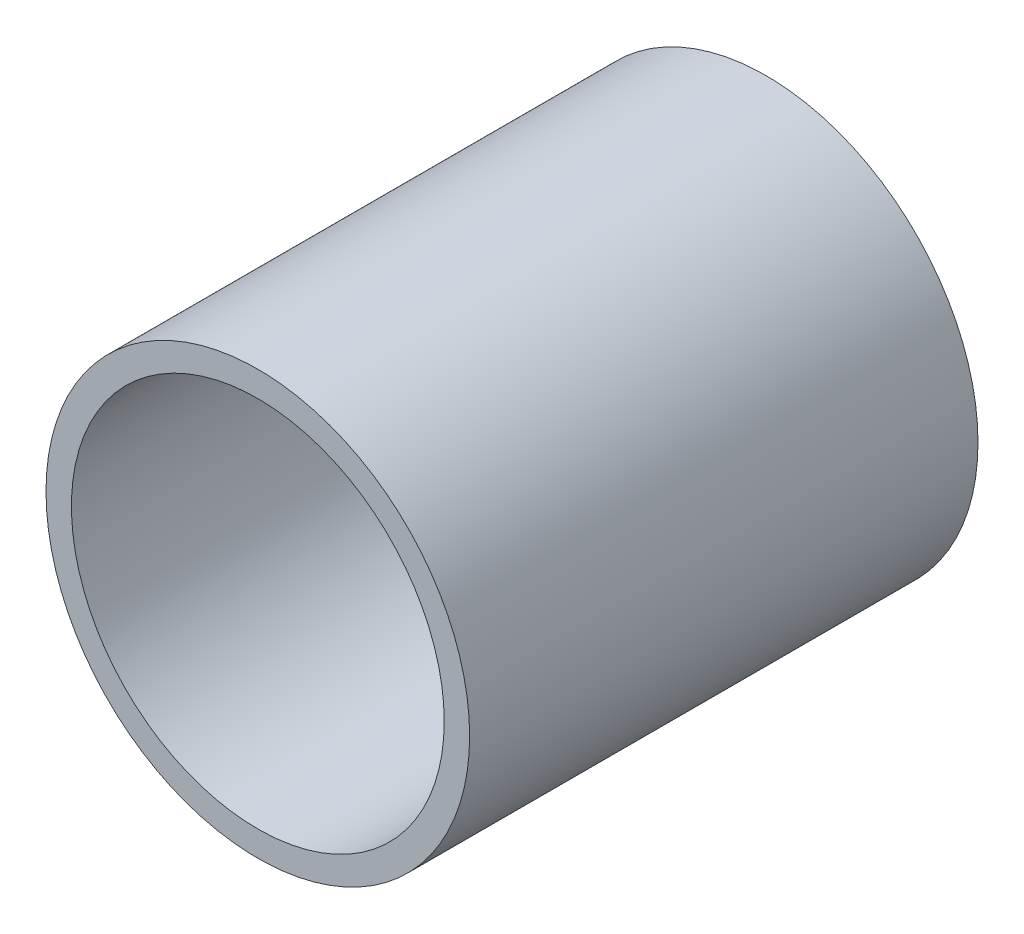
ISO-10303-21;
HEADER;
FILE_DESCRIPTION(('STEP AP214'),'2;1');
FILE_NAME('part.step','',(''),(''),'','','');
FILE_SCHEMA(('AUTOMOTIVE_DESIGN { 1 0 10303 214 1 1 1 1 }'));
ENDSEC;
DATA;
#1=APPLICATION_CONTEXT('core data for automotive mechanical design processes');
#2=APPLICATION_PROTOCOL_DEFINITION('international standard','automotive_design',2000,#1);
#3=PRODUCT_CONTEXT('',#1,'mechanical');
#4=PRODUCT('Part','Part','',(#3));
#5=PRODUCT_RELATED_PRODUCT_CATEGORY('part','',(#4));
#6=PRODUCT_DEFINITION_FORMATION('','',#4);
#7=PRODUCT_DEFINITION_CONTEXT('part definition',#1,'design');
#8=PRODUCT_DEFINITION('design','',#6,#7);
#9=PRODUCT_DEFINITION_SHAPE('','',#8);
#10=(LENGTH_UNIT() NAMED_UNIT(*) SI_UNIT(.MILLI.,.METRE.));
#11=(NAMED_UNIT(*) PLANE_ANGLE_UNIT() SI_UNIT($,.RADIAN.));
#12=(NAMED_UNIT(*) SI_UNIT($,.STERADIAN.) SOLID_ANGLE_UNIT());
#13=UNCERTAINTY_MEASURE_WITH_UNIT(LENGTH_MEASURE(1.E-05),#10,'distance_accuracy_value','');
#14=(GEOMETRIC_REPRESENTATION_CONTEXT(3) GLOBAL_UNCERTAINTY_ASSIGNED_CONTEXT((#13)) GLOBAL_UNIT_ASSIGNED_CONTEXT((#10,
#11,#12)) REPRESENTATION_CONTEXT('',''));
#15=CARTESIAN_POINT('',(0.,0.,0.));
#16=DIRECTION('',(0.,0.,1.));
#17=DIRECTION('',(1.,0.,0.));
#18=AXIS2_PLACEMENT_3D('',#15,#16,#17);
#19=CARTESIAN_POINT('',(0.,0.,6.));
#20=DIRECTION('',(0.,0.,1.));
#21=DIRECTION('',(1.,0.,0.));
#22=AXIS2_PLACEMENT_3D('',#19,#20,#21);
#23=PLANE('',#22);
#24=CARTESIAN_POINT('',(0.,0.,6.));
#25=DIRECTION('',(0.,0.,1.));
#26=DIRECTION('',(1.,0.,0.));
#27=AXIS2_PLACEMENT_3D('',#24,#25,#26);
#28=CIRCLE('',#27,2.5);
#29=CARTESIAN_POINT('',(2.5,0.,6.));
#30=VERTEX_POINT('',#29);
#31=EDGE_CURVE('E10',#30,#30,#28,.T.);
#32=ORIENTED_EDGE('',*,*,#31,.T.);
#33=EDGE_LOOP('',(#32));
#34=FACE_BOUND('',#33,.T.);
#35=CARTESIAN_POINT('',(0.,0.,6.));
#36=DIRECTION('',(0.,0.,1.));
#37=DIRECTION('',(1.,0.,0.));
#38=AXIS2_PLACEMENT_3D('',#35,#36,#37);
#39=CIRCLE('',#38,2.2);
#40=CARTESIAN_POINT('',(2.2,0.,6.));
#41=VERTEX_POINT('',#40);
#42=EDGE_CURVE('E43',#41,#41,#39,.T.);
#43=ORIENTED_EDGE('',*,*,#42,.F.);
#44=EDGE_LOOP('',(#43));
#45=FACE_BOUND('',#44,.T.);
#46=ADVANCED_FACE('F32',(#34,#45),#23,.T.);
#47=CARTESIAN_POINT('',(0.,0.,0.));
#48=DIRECTION('',(0.,0.,1.));
#49=DIRECTION('',(1.,0.,0.));
#50=AXIS2_PLACEMENT_3D('',#47,#48,#49);
#51=PLANE('',#50);
#52=CARTESIAN_POINT('',(0.,0.,0.));
#53=DIRECTION('',(0.,0.,1.));
#54=DIRECTION('',(1.,0.,0.));
#55=AXIS2_PLACEMENT_3D('',#52,#53,#54);
#56=CIRCLE('',#55,2.5);
#57=CARTESIAN_POINT('',(2.5,0.,0.));
#58=VERTEX_POINT('',#57);
#59=EDGE_CURVE('E36',#58,#58,#56,.T.);
#60=ORIENTED_EDGE('',*,*,#59,.F.);
#61=EDGE_LOOP('',(#60));
#62=FACE_BOUND('',#61,.T.);
#63=CARTESIAN_POINT('',(0.,0.,0.));
#64=DIRECTION('',(0.,0.,1.));
#65=DIRECTION('',(1.,0.,0.));
#66=AXIS2_PLACEMENT_3D('',#63,#64,#65);
#67=CIRCLE('',#66,2.2);
#68=CARTESIAN_POINT('',(2.2,0.,0.));
#69=VERTEX_POINT('',#68);
#70=EDGE_CURVE('E45',#69,#69,#67,.T.);
#71=ORIENTED_EDGE('',*,*,#70,.T.);
#72=EDGE_LOOP('',(#71));
#73=FACE_BOUND('',#72,.T.);
#74=ADVANCED_FACE('F55',(#62,#73),#51,.F.);
#75=CARTESIAN_POINT('',(0.,0.,6.));
#76=DIRECTION('',(0.,0.,-1.));
#77=DIRECTION('',(-1.,0.,0.));
#78=AXIS2_PLACEMENT_3D('',#75,#76,#77);
#79=CYLINDRICAL_SURFACE('',#78,2.5);
#80=ORIENTED_EDGE('',*,*,#31,.F.);
#81=EDGE_LOOP('',(#80));
#82=FACE_BOUND('',#81,.T.);
#83=ORIENTED_EDGE('',*,*,#59,.T.);
#84=EDGE_LOOP('',(#83));
#85=FACE_BOUND('',#84,.T.);
#86=ADVANCED_FACE('F34',(#82,#85),#79,.T.);
#87=CARTESIAN_POINT('',(0.,0.,6.));
#88=DIRECTION('',(0.,0.,-1.));
#89=DIRECTION('',(-1.,0.,0.));
#90=AXIS2_PLACEMENT_3D('',#87,#88,#89);
#91=CYLINDRICAL_SURFACE('',#90,2.2);
#92=ORIENTED_EDGE('',*,*,#42,.T.);
#93=EDGE_LOOP('',(#92));
#94=FACE_BOUND('',#93,.T.);
#95=ORIENTED_EDGE('',*,*,#70,.F.);
#96=EDGE_LOOP('',(#95));
#97=FACE_BOUND('',#96,.T.);
#98=ADVANCED_FACE('F51',(#94,#97),#91,.F.);
#99=CLOSED_SHELL('',(#46,#74,#86,#98));
#100=MANIFOLD_SOLID_BREP('B2',#99);
#101=ADVANCED_BREP_SHAPE_REPRESENTATION('',(#18,#100),#14);
#102=SHAPE_DEFINITION_REPRESENTATION(#9,#101);
ENDSEC;
END-ISO-10303-21;
